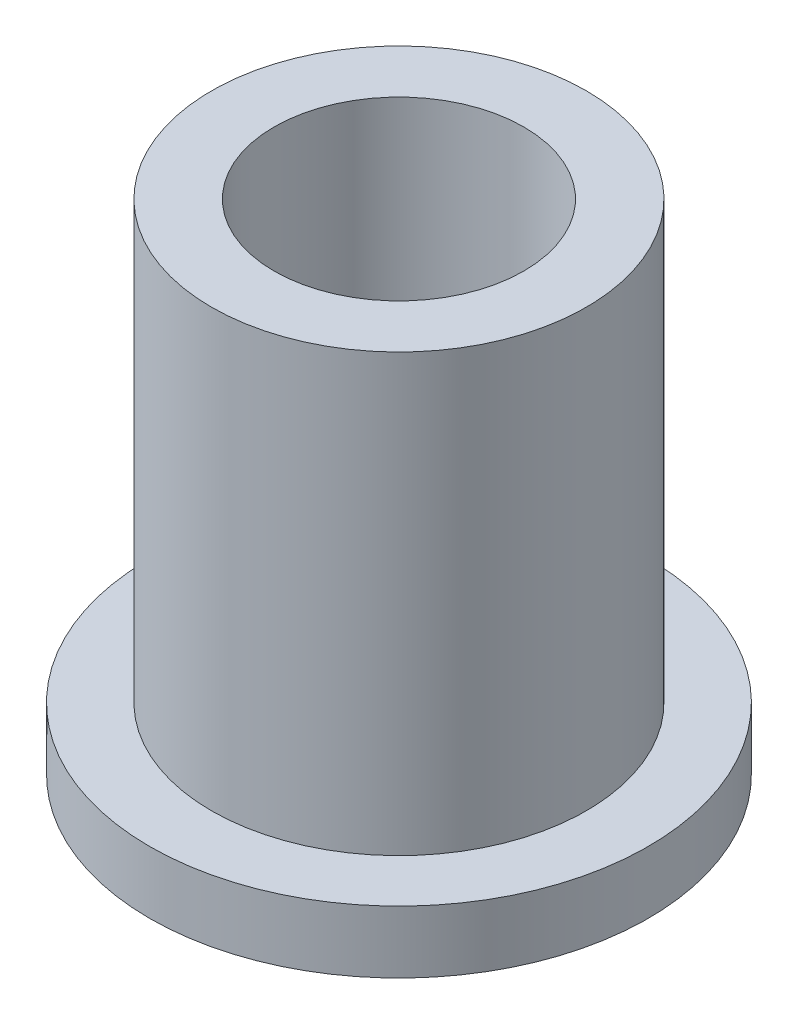
ISO-10303-21;
HEADER;
FILE_DESCRIPTION(('STEP AP214'),'2;1');
FILE_NAME('part.step','',(''),(''),'','','');
FILE_SCHEMA(('AUTOMOTIVE_DESIGN { 1 0 10303 214 1 1 1 1 }'));
ENDSEC;
DATA;
#1=APPLICATION_CONTEXT('core data for automotive mechanical design processes');
#2=APPLICATION_PROTOCOL_DEFINITION('international standard','automotive_design',2000,#1);
#3=PRODUCT_CONTEXT('',#1,'mechanical');
#4=PRODUCT('Part','Part','',(#3));
#5=PRODUCT_RELATED_PRODUCT_CATEGORY('part','',(#4));
#6=PRODUCT_DEFINITION_FORMATION('','',#4);
#7=PRODUCT_DEFINITION_CONTEXT('part definition',#1,'design');
#8=PRODUCT_DEFINITION('design','',#6,#7);
#9=PRODUCT_DEFINITION_SHAPE('','',#8);
#10=(LENGTH_UNIT() NAMED_UNIT(*) SI_UNIT(.MILLI.,.METRE.));
#11=(NAMED_UNIT(*) PLANE_ANGLE_UNIT() SI_UNIT($,.RADIAN.));
#12=(NAMED_UNIT(*) SI_UNIT($,.STERADIAN.) SOLID_ANGLE_UNIT());
#13=UNCERTAINTY_MEASURE_WITH_UNIT(LENGTH_MEASURE(1.E-05),#10,'distance_accuracy_value','');
#14=(GEOMETRIC_REPRESENTATION_CONTEXT(3) GLOBAL_UNCERTAINTY_ASSIGNED_CONTEXT((#13)) GLOBAL_UNIT_ASSIGNED_CONTEXT((#10,
#11,#12)) REPRESENTATION_CONTEXT('',''));
#15=CARTESIAN_POINT('',(0.,0.,0.));
#16=DIRECTION('',(0.,0.,1.));
#17=DIRECTION('',(1.,0.,0.));
#18=AXIS2_PLACEMENT_3D('',#15,#16,#17);
#19=CARTESIAN_POINT('',(0.,25.4,0.));
#20=DIRECTION('',(0.,1.,0.));
#21=DIRECTION('',(0.,0.,1.));
#22=AXIS2_PLACEMENT_3D('',#19,#20,#21);
#23=PLANE('',#22);
#24=CARTESIAN_POINT('',(0.,25.4,0.));
#25=DIRECTION('',(0.,1.,0.));
#26=DIRECTION('',(0.,0.,1.));
#27=AXIS2_PLACEMENT_3D('',#24,#25,#26);
#28=CIRCLE('',#27,9.5504);
#29=CARTESIAN_POINT('',(0.,25.4,9.5504));
#30=VERTEX_POINT('',#29);
#31=EDGE_CURVE('E10',#30,#30,#28,.T.);
#32=ORIENTED_EDGE('',*,*,#31,.T.);
#33=EDGE_LOOP('',(#32));
#34=FACE_BOUND('',#33,.T.);
#35=CARTESIAN_POINT('',(0.,25.4,0.));
#36=DIRECTION('',(0.,1.,0.));
#37=DIRECTION('',(0.,0.,1.));
#38=AXIS2_PLACEMENT_3D('',#35,#36,#37);
#39=CIRCLE('',#38,6.3627);
#40=CARTESIAN_POINT('',(0.,25.4,6.3627));
#41=VERTEX_POINT('',#40);
#42=EDGE_CURVE('E37',#41,#41,#39,.T.);
#43=ORIENTED_EDGE('',*,*,#42,.F.);
#44=EDGE_LOOP('',(#43));
#45=FACE_BOUND('',#44,.T.);
#46=ADVANCED_FACE('F30',(#34,#45),#23,.T.);
#47=CARTESIAN_POINT('',(0.,0.,0.));
#48=DIRECTION('',(0.,1.,0.));
#49=DIRECTION('',(0.,0.,1.));
#50=AXIS2_PLACEMENT_3D('',#47,#48,#49);
#51=PLANE('',#50);
#52=CARTESIAN_POINT('',(0.,0.,0.));
#53=DIRECTION('',(0.,1.,0.));
#54=DIRECTION('',(0.,0.,1.));
#55=AXIS2_PLACEMENT_3D('',#52,#53,#54);
#56=CIRCLE('',#55,6.3627);
#57=CARTESIAN_POINT('',(0.,0.,6.3627));
#58=VERTEX_POINT('',#57);
#59=EDGE_CURVE('E41',#58,#58,#56,.T.);
#60=ORIENTED_EDGE('',*,*,#59,.T.);
#61=EDGE_LOOP('',(#60));
#62=FACE_BOUND('',#61,.T.);
#63=CARTESIAN_POINT('',(0.,0.,0.));
#64=DIRECTION('',(0.,1.,0.));
#65=DIRECTION('',(0.,0.,1.));
#66=AXIS2_PLACEMENT_3D('',#63,#64,#65);
#67=CIRCLE('',#66,12.7);
#68=CARTESIAN_POINT('',(0.,0.,12.7));
#69=VERTEX_POINT('',#68);
#70=EDGE_CURVE('E48',#69,#69,#67,.T.);
#71=ORIENTED_EDGE('',*,*,#70,.F.);
#72=EDGE_LOOP('',(#71));
#73=FACE_BOUND('',#72,.T.);
#74=ADVANCED_FACE('F73',(#62,#73),#51,.F.);
#75=CARTESIAN_POINT('',(0.,25.4,0.));
#76=DIRECTION('',(0.,-1.,0.));
#77=DIRECTION('',(0.,0.,-1.));
#78=AXIS2_PLACEMENT_3D('',#75,#76,#77);
#79=CYLINDRICAL_SURFACE('',#78,9.5504);
#80=CARTESIAN_POINT('',(0.,3.175,0.));
#81=DIRECTION('',(0.,1.,0.));
#82=DIRECTION('',(0.,0.,1.));
#83=AXIS2_PLACEMENT_3D('',#80,#81,#82);
#84=CIRCLE('',#83,9.5504);
#85=CARTESIAN_POINT('',(0.,3.175,9.5504));
#86=VERTEX_POINT('',#85);
#87=EDGE_CURVE('E51',#86,#86,#84,.T.);
#88=ORIENTED_EDGE('',*,*,#87,.T.);
#89=EDGE_LOOP('',(#88));
#90=FACE_BOUND('',#89,.T.);
#91=ORIENTED_EDGE('',*,*,#31,.F.);
#92=EDGE_LOOP('',(#91));
#93=FACE_BOUND('',#92,.T.);
#94=ADVANCED_FACE('F32',(#90,#93),#79,.T.);
#95=CARTESIAN_POINT('',(0.,25.4,0.));
#96=DIRECTION('',(0.,-1.,0.));
#97=DIRECTION('',(0.,0.,-1.));
#98=AXIS2_PLACEMENT_3D('',#95,#96,#97);
#99=CYLINDRICAL_SURFACE('',#98,6.3627);
#100=ORIENTED_EDGE('',*,*,#42,.T.);
#101=EDGE_LOOP('',(#100));
#102=FACE_BOUND('',#101,.T.);
#103=ORIENTED_EDGE('',*,*,#59,.F.);
#104=EDGE_LOOP('',(#103));
#105=FACE_BOUND('',#104,.T.);
#106=ADVANCED_FACE('F62',(#102,#105),#99,.F.);
#107=CARTESIAN_POINT('',(0.,3.175,0.));
#108=DIRECTION('',(0.,1.,0.));
#109=DIRECTION('',(0.,0.,1.));
#110=AXIS2_PLACEMENT_3D('',#107,#108,#109);
#111=PLANE('',#110);
#112=CARTESIAN_POINT('',(0.,3.175,0.));
#113=DIRECTION('',(0.,1.,0.));
#114=DIRECTION('',(0.,0.,1.));
#115=AXIS2_PLACEMENT_3D('',#112,#113,#114);
#116=CIRCLE('',#115,12.7);
#117=CARTESIAN_POINT('',(0.,3.175,12.7));
#118=VERTEX_POINT('',#117);
#119=EDGE_CURVE('E46',#118,#118,#116,.T.);
#120=ORIENTED_EDGE('',*,*,#119,.T.);
#121=EDGE_LOOP('',(#120));
#122=FACE_BOUND('',#121,.T.);
#123=ORIENTED_EDGE('',*,*,#87,.F.);
#124=EDGE_LOOP('',(#123));
#125=FACE_BOUND('',#124,.T.);
#126=ADVANCED_FACE('F59',(#122,#125),#111,.T.);
#127=CARTESIAN_POINT('',(0.,3.175,0.));
#128=DIRECTION('',(0.,-1.,0.));
#129=DIRECTION('',(0.,0.,-1.));
#130=AXIS2_PLACEMENT_3D('',#127,#128,#129);
#131=CYLINDRICAL_SURFACE('',#130,12.7);
#132=ORIENTED_EDGE('',*,*,#119,.F.);
#133=EDGE_LOOP('',(#132));
#134=FACE_BOUND('',#133,.T.);
#135=ORIENTED_EDGE('',*,*,#70,.T.);
#136=EDGE_LOOP('',(#135));
#137=FACE_BOUND('',#136,.T.);
#138=ADVANCED_FACE('F61',(#134,#137),#131,.T.);
#139=CLOSED_SHELL('',(#46,#74,#94,#106,#126,#138));
#140=MANIFOLD_SOLID_BREP('B2',#139);
#141=ADVANCED_BREP_SHAPE_REPRESENTATION('',(#18,#140),#14);
#142=SHAPE_DEFINITION_REPRESENTATION(#9,#141);
ENDSEC;
END-ISO-10303-21;
